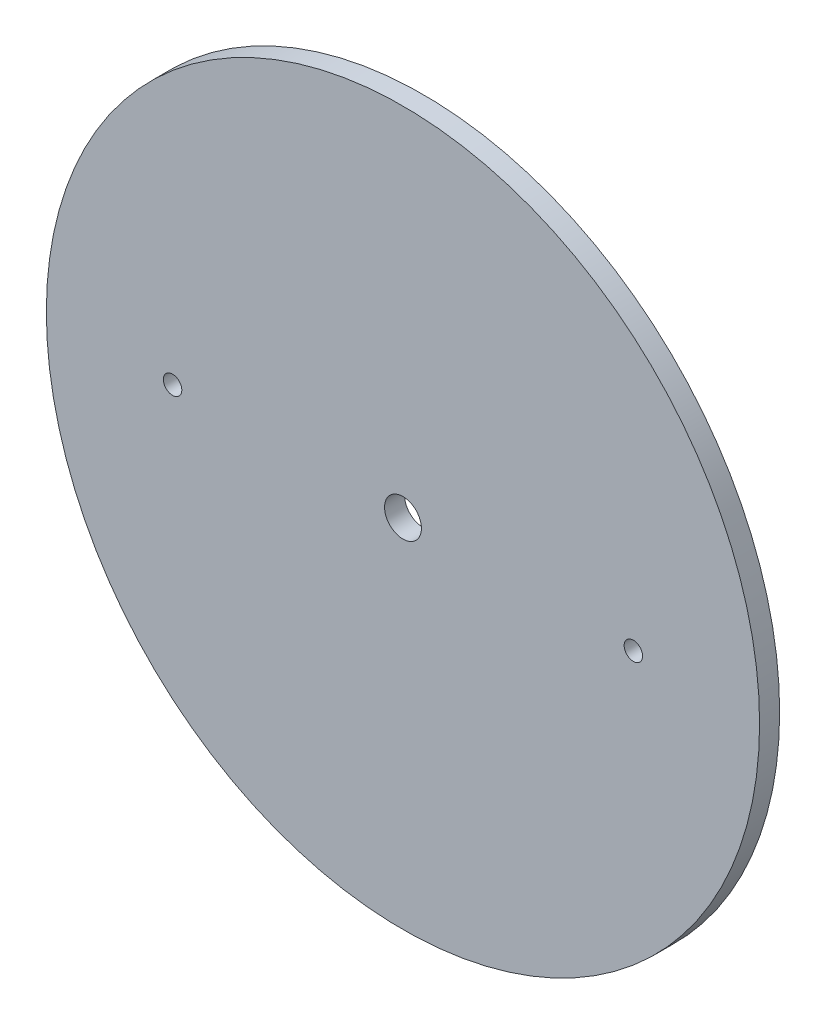
ISO-10303-21;
HEADER;
FILE_DESCRIPTION(('STEP AP214'),'2;1');
FILE_NAME('part.step','',(''),(''),'','','');
FILE_SCHEMA(('AUTOMOTIVE_DESIGN { 1 0 10303 214 1 1 1 1 }'));
ENDSEC;
DATA;
#1=APPLICATION_CONTEXT('core data for automotive mechanical design processes');
#2=APPLICATION_PROTOCOL_DEFINITION('international standard','automotive_design',2000,#1);
#3=PRODUCT_CONTEXT('',#1,'mechanical');
#4=PRODUCT('Part','Part','',(#3));
#5=PRODUCT_RELATED_PRODUCT_CATEGORY('part','',(#4));
#6=PRODUCT_DEFINITION_FORMATION('','',#4);
#7=PRODUCT_DEFINITION_CONTEXT('part definition',#1,'design');
#8=PRODUCT_DEFINITION('design','',#6,#7);
#9=PRODUCT_DEFINITION_SHAPE('','',#8);
#10=(LENGTH_UNIT() NAMED_UNIT(*) SI_UNIT(.MILLI.,.METRE.));
#11=(NAMED_UNIT(*) PLANE_ANGLE_UNIT() SI_UNIT($,.RADIAN.));
#12=(NAMED_UNIT(*) SI_UNIT($,.STERADIAN.) SOLID_ANGLE_UNIT());
#13=UNCERTAINTY_MEASURE_WITH_UNIT(LENGTH_MEASURE(1.E-05),#10,'distance_accuracy_value','');
#14=(GEOMETRIC_REPRESENTATION_CONTEXT(3) GLOBAL_UNCERTAINTY_ASSIGNED_CONTEXT((#13)) GLOBAL_UNIT_ASSIGNED_CONTEXT((#10,
#11,#12)) REPRESENTATION_CONTEXT('',''));
#15=CARTESIAN_POINT('',(0.,0.,0.));
#16=DIRECTION('',(0.,0.,1.));
#17=DIRECTION('',(1.,0.,0.));
#18=AXIS2_PLACEMENT_3D('',#15,#16,#17);
#19=CARTESIAN_POINT('',(0.,0.,-1.));
#20=DIRECTION('',(0.,0.,-1.));
#21=DIRECTION('',(-1.,0.,0.));
#22=AXIS2_PLACEMENT_3D('',#19,#20,#21);
#23=CYLINDRICAL_SURFACE('',#22,71.1);
#24=CARTESIAN_POINT('',(0.,0.,-1.));
#25=DIRECTION('',(0.,0.,-1.));
#26=DIRECTION('',(1.,0.,0.));
#27=AXIS2_PLACEMENT_3D('',#24,#25,#26);
#28=CIRCLE('',#27,71.1);
#29=CARTESIAN_POINT('',(71.1,0.,-1.));
#30=VERTEX_POINT('',#29);
#31=EDGE_CURVE('E10',#30,#30,#28,.T.);
#32=ORIENTED_EDGE('',*,*,#31,.T.);
#33=EDGE_LOOP('',(#32));
#34=FACE_BOUND('',#33,.T.);
#35=CARTESIAN_POINT('',(0.,0.,-5.));
#36=DIRECTION('',(0.,0.,-1.));
#37=DIRECTION('',(1.,0.,0.));
#38=AXIS2_PLACEMENT_3D('',#35,#36,#37);
#39=CIRCLE('',#38,71.1);
#40=CARTESIAN_POINT('',(71.1,0.,-5.));
#41=VERTEX_POINT('',#40);
#42=EDGE_CURVE('E36',#41,#41,#39,.T.);
#43=ORIENTED_EDGE('',*,*,#42,.F.);
#44=EDGE_LOOP('',(#43));
#45=FACE_BOUND('',#44,.T.);
#46=ADVANCED_FACE('F33',(#34,#45),#23,.T.);
#47=CARTESIAN_POINT('',(0.,0.,-1.));
#48=DIRECTION('',(0.,0.,1.));
#49=DIRECTION('',(1.,0.,0.));
#50=AXIS2_PLACEMENT_3D('',#47,#48,#49);
#51=PLANE('',#50);
#52=CARTESIAN_POINT('',(0.,0.,-1.));
#53=DIRECTION('',(0.,0.,-1.));
#54=DIRECTION('',(1.,0.,0.));
#55=AXIS2_PLACEMENT_3D('',#52,#53,#54);
#56=CIRCLE('',#55,3.6745406824147);
#57=CARTESIAN_POINT('',(3.6745406824147,0.,-1.));
#58=VERTEX_POINT('',#57);
#59=EDGE_CURVE('E54',#58,#58,#56,.T.);
#60=ORIENTED_EDGE('',*,*,#59,.T.);
#61=EDGE_LOOP('',(#60));
#62=FACE_BOUND('',#61,.T.);
#63=CARTESIAN_POINT('',(45.9317585301837,0.,-1.));
#64=DIRECTION('',(0.,0.,-1.));
#65=DIRECTION('',(1.,0.,0.));
#66=AXIS2_PLACEMENT_3D('',#63,#64,#65);
#67=CIRCLE('',#66,1.83727034120735);
#68=CARTESIAN_POINT('',(47.7690288713911,0.,-1.));
#69=VERTEX_POINT('',#68);
#70=EDGE_CURVE('E48',#69,#69,#67,.T.);
#71=ORIENTED_EDGE('',*,*,#70,.T.);
#72=EDGE_LOOP('',(#71));
#73=FACE_BOUND('',#72,.T.);
#74=CARTESIAN_POINT('',(-45.9317585301837,0.,-1.));
#75=DIRECTION('',(0.,0.,-1.));
#76=DIRECTION('',(1.,0.,0.));
#77=AXIS2_PLACEMENT_3D('',#74,#75,#76);
#78=CIRCLE('',#77,1.83727034120735);
#79=CARTESIAN_POINT('',(-44.0944881889764,0.,-1.));
#80=VERTEX_POINT('',#79);
#81=EDGE_CURVE('E43',#80,#80,#78,.T.);
#82=ORIENTED_EDGE('',*,*,#81,.T.);
#83=EDGE_LOOP('',(#82));
#84=FACE_BOUND('',#83,.T.);
#85=ORIENTED_EDGE('',*,*,#31,.F.);
#86=EDGE_LOOP('',(#85));
#87=FACE_BOUND('',#86,.T.);
#88=ADVANCED_FACE('F63',(#62,#73,#84,#87),#51,.T.);
#89=CARTESIAN_POINT('',(0.,0.,-5.));
#90=DIRECTION('',(0.,0.,1.));
#91=DIRECTION('',(1.,0.,0.));
#92=AXIS2_PLACEMENT_3D('',#89,#90,#91);
#93=PLANE('',#92);
#94=CARTESIAN_POINT('',(0.,0.,-5.));
#95=DIRECTION('',(0.,0.,-1.));
#96=DIRECTION('',(1.,0.,0.));
#97=AXIS2_PLACEMENT_3D('',#94,#95,#96);
#98=CIRCLE('',#97,3.6745406824147);
#99=CARTESIAN_POINT('',(3.6745406824147,0.,-5.));
#100=VERTEX_POINT('',#99);
#101=EDGE_CURVE('E57',#100,#100,#98,.T.);
#102=ORIENTED_EDGE('',*,*,#101,.F.);
#103=EDGE_LOOP('',(#102));
#104=FACE_BOUND('',#103,.T.);
#105=CARTESIAN_POINT('',(45.9317585301837,0.,-5.));
#106=DIRECTION('',(0.,0.,-1.));
#107=DIRECTION('',(1.,0.,0.));
#108=AXIS2_PLACEMENT_3D('',#105,#106,#107);
#109=CIRCLE('',#108,1.83727034120735);
#110=CARTESIAN_POINT('',(47.7690288713911,0.,-5.));
#111=VERTEX_POINT('',#110);
#112=EDGE_CURVE('E51',#111,#111,#109,.T.);
#113=ORIENTED_EDGE('',*,*,#112,.F.);
#114=EDGE_LOOP('',(#113));
#115=FACE_BOUND('',#114,.T.);
#116=CARTESIAN_POINT('',(-45.9317585301837,0.,-5.));
#117=DIRECTION('',(0.,0.,-1.));
#118=DIRECTION('',(1.,0.,0.));
#119=AXIS2_PLACEMENT_3D('',#116,#117,#118);
#120=CIRCLE('',#119,1.83727034120735);
#121=CARTESIAN_POINT('',(-44.0944881889764,0.,-5.));
#122=VERTEX_POINT('',#121);
#123=EDGE_CURVE('E45',#122,#122,#120,.T.);
#124=ORIENTED_EDGE('',*,*,#123,.F.);
#125=EDGE_LOOP('',(#124));
#126=FACE_BOUND('',#125,.T.);
#127=ORIENTED_EDGE('',*,*,#42,.T.);
#128=EDGE_LOOP('',(#127));
#129=FACE_BOUND('',#128,.T.);
#130=ADVANCED_FACE('F73',(#104,#115,#126,#129),#93,.F.);
#131=CARTESIAN_POINT('',(-45.9317585301837,0.,-1.));
#132=DIRECTION('',(0.,0.,-1.));
#133=DIRECTION('',(-1.,0.,0.));
#134=AXIS2_PLACEMENT_3D('',#131,#132,#133);
#135=CYLINDRICAL_SURFACE('',#134,1.83727034120735);
#136=ORIENTED_EDGE('',*,*,#81,.F.);
#137=EDGE_LOOP('',(#136));
#138=FACE_BOUND('',#137,.T.);
#139=ORIENTED_EDGE('',*,*,#123,.T.);
#140=EDGE_LOOP('',(#139));
#141=FACE_BOUND('',#140,.T.);
#142=ADVANCED_FACE('F76',(#138,#141),#135,.F.);
#143=CARTESIAN_POINT('',(45.9317585301837,0.,-1.));
#144=DIRECTION('',(0.,0.,-1.));
#145=DIRECTION('',(-1.,0.,0.));
#146=AXIS2_PLACEMENT_3D('',#143,#144,#145);
#147=CYLINDRICAL_SURFACE('',#146,1.83727034120735);
#148=ORIENTED_EDGE('',*,*,#70,.F.);
#149=EDGE_LOOP('',(#148));
#150=FACE_BOUND('',#149,.T.);
#151=ORIENTED_EDGE('',*,*,#112,.T.);
#152=EDGE_LOOP('',(#151));
#153=FACE_BOUND('',#152,.T.);
#154=ADVANCED_FACE('F69',(#150,#153),#147,.F.);
#155=CARTESIAN_POINT('',(0.,0.,-1.));
#156=DIRECTION('',(0.,0.,-1.));
#157=DIRECTION('',(-1.,0.,0.));
#158=AXIS2_PLACEMENT_3D('',#155,#156,#157);
#159=CYLINDRICAL_SURFACE('',#158,3.6745406824147);
#160=ORIENTED_EDGE('',*,*,#59,.F.);
#161=EDGE_LOOP('',(#160));
#162=FACE_BOUND('',#161,.T.);
#163=ORIENTED_EDGE('',*,*,#101,.T.);
#164=EDGE_LOOP('',(#163));
#165=FACE_BOUND('',#164,.T.);
#166=ADVANCED_FACE('F66',(#162,#165),#159,.F.);
#167=CLOSED_SHELL('',(#46,#88,#130,#142,#154,#166));
#168=MANIFOLD_SOLID_BREP('B2',#167);
#169=ADVANCED_BREP_SHAPE_REPRESENTATION('',(#18,#168),#14);
#170=SHAPE_DEFINITION_REPRESENTATION(#9,#169);
ENDSEC;
END-ISO-10303-21;
